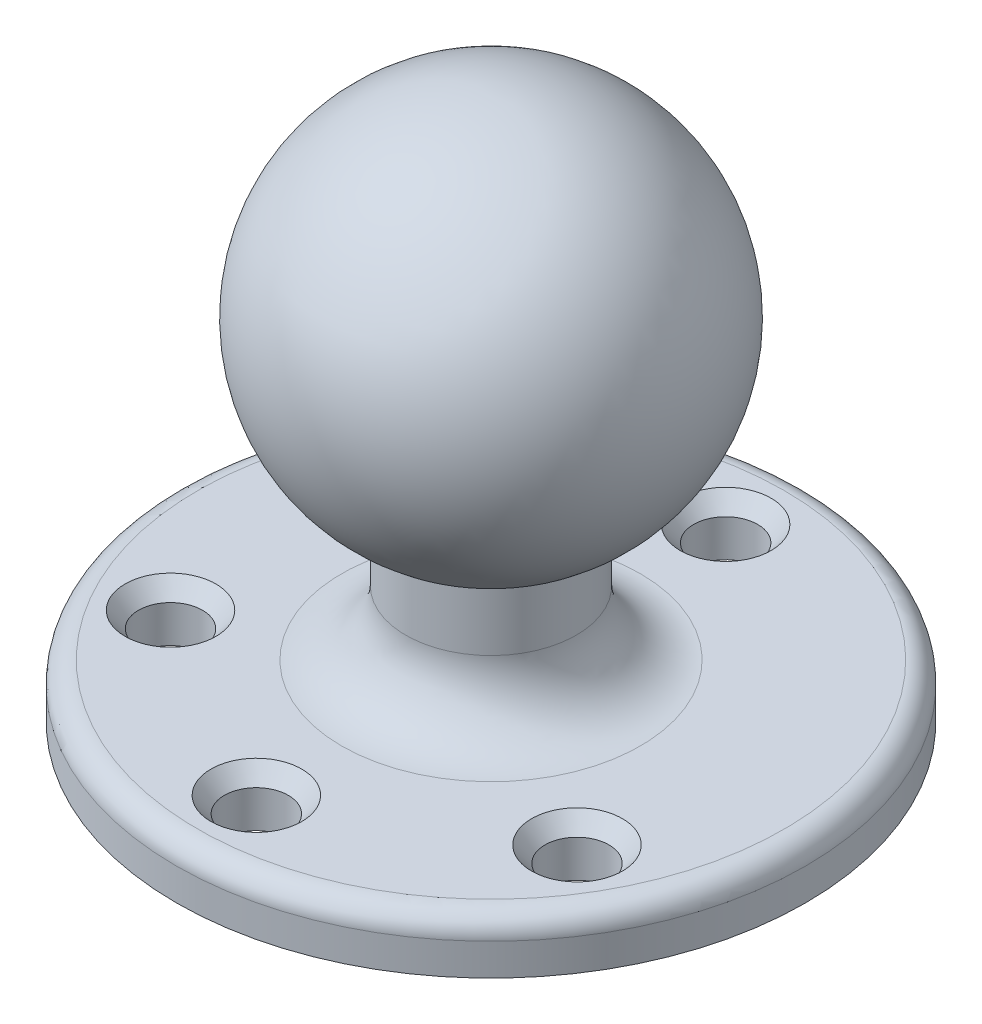
ISO-10303-21;
HEADER;
FILE_DESCRIPTION(('STEP AP214'),'2;1');
FILE_NAME('part.step','',(''),(''),'','','');
FILE_SCHEMA(('AUTOMOTIVE_DESIGN { 1 0 10303 214 1 1 1 1 }'));
ENDSEC;
DATA;
#1=APPLICATION_CONTEXT('core data for automotive mechanical design processes');
#2=APPLICATION_PROTOCOL_DEFINITION('international standard','automotive_design',2000,#1);
#3=PRODUCT_CONTEXT('',#1,'mechanical');
#4=PRODUCT('Part','Part','',(#3));
#5=PRODUCT_RELATED_PRODUCT_CATEGORY('part','',(#4));
#6=PRODUCT_DEFINITION_FORMATION('','',#4);
#7=PRODUCT_DEFINITION_CONTEXT('part definition',#1,'design');
#8=PRODUCT_DEFINITION('design','',#6,#7);
#9=PRODUCT_DEFINITION_SHAPE('','',#8);
#10=(LENGTH_UNIT() NAMED_UNIT(*) SI_UNIT(.MILLI.,.METRE.));
#11=(NAMED_UNIT(*) PLANE_ANGLE_UNIT() SI_UNIT($,.RADIAN.));
#12=(NAMED_UNIT(*) SI_UNIT($,.STERADIAN.) SOLID_ANGLE_UNIT());
#13=UNCERTAINTY_MEASURE_WITH_UNIT(LENGTH_MEASURE(1.E-05),#10,'distance_accuracy_value','');
#14=(GEOMETRIC_REPRESENTATION_CONTEXT(3) GLOBAL_UNCERTAINTY_ASSIGNED_CONTEXT((#13)) GLOBAL_UNIT_ASSIGNED_CONTEXT((#10,
#11,#12)) REPRESENTATION_CONTEXT('',''));
#15=CARTESIAN_POINT('',(0.,0.,0.));
#16=DIRECTION('',(0.,0.,1.));
#17=DIRECTION('',(1.,0.,0.));
#18=AXIS2_PLACEMENT_3D('',#15,#16,#17);
#19=CARTESIAN_POINT('',(0.,0.,0.));
#20=DIRECTION('',(0.,-1.,0.));
#21=DIRECTION('',(0.,0.,-1.));
#22=AXIS2_PLACEMENT_3D('',#19,#20,#21);
#23=PLANE('',#22);
#24=CARTESIAN_POINT('',(30.2514,0.,17.4498));
#25=DIRECTION('',(0.,-1.,0.));
#26=DIRECTION('',(0.,0.,-1.));
#27=AXIS2_PLACEMENT_3D('',#24,#25,#26);
#28=CIRCLE('',#27,4.7625);
#29=CARTESIAN_POINT('',(30.2514,0.,12.6873));
#30=VERTEX_POINT('',#29);
#31=EDGE_CURVE('E101',#30,#30,#28,.T.);
#32=ORIENTED_EDGE('',*,*,#31,.F.);
#33=EDGE_LOOP('',(#32));
#34=FACE_BOUND('',#33,.T.);
#35=CARTESIAN_POINT('',(0.,0.,-34.925));
#36=DIRECTION('',(0.,-1.,0.));
#37=DIRECTION('',(0.,0.,-1.));
#38=AXIS2_PLACEMENT_3D('',#35,#36,#37);
#39=CIRCLE('',#38,4.7625);
#40=CARTESIAN_POINT('',(0.,0.,-39.6875));
#41=VERTEX_POINT('',#40);
#42=EDGE_CURVE('E105',#41,#41,#39,.T.);
#43=ORIENTED_EDGE('',*,*,#42,.F.);
#44=EDGE_LOOP('',(#43));
#45=FACE_BOUND('',#44,.T.);
#46=CARTESIAN_POINT('',(0.,0.,34.925));
#47=DIRECTION('',(0.,-1.,0.));
#48=DIRECTION('',(0.,0.,-1.));
#49=AXIS2_PLACEMENT_3D('',#46,#47,#48);
#50=CIRCLE('',#49,4.7625);
#51=CARTESIAN_POINT('',(0.,0.,30.1625));
#52=VERTEX_POINT('',#51);
#53=EDGE_CURVE('E102',#52,#52,#50,.T.);
#54=ORIENTED_EDGE('',*,*,#53,.F.);
#55=EDGE_LOOP('',(#54));
#56=FACE_BOUND('',#55,.T.);
#57=CARTESIAN_POINT('',(-30.2514,0.,17.4498));
#58=DIRECTION('',(0.,-1.,0.));
#59=DIRECTION('',(0.,0.,-1.));
#60=AXIS2_PLACEMENT_3D('',#57,#58,#59);
#61=CIRCLE('',#60,4.7625);
#62=CARTESIAN_POINT('',(-30.2514,0.,12.6873));
#63=VERTEX_POINT('',#62);
#64=EDGE_CURVE('E98',#63,#63,#61,.T.);
#65=ORIENTED_EDGE('',*,*,#64,.F.);
#66=EDGE_LOOP('',(#65));
#67=FACE_BOUND('',#66,.T.);
#68=CARTESIAN_POINT('',(0.,0.,0.));
#69=DIRECTION('',(0.,-1.,0.));
#70=DIRECTION('',(0.,0.,-1.));
#71=AXIS2_PLACEMENT_3D('',#68,#69,#70);
#72=CIRCLE('',#71,46.8249);
#73=CARTESIAN_POINT('',(0.,0.,-46.8249));
#74=VERTEX_POINT('',#73);
#75=EDGE_CURVE('E80',#74,#74,#72,.T.);
#76=ORIENTED_EDGE('',*,*,#75,.T.);
#77=EDGE_LOOP('',(#76));
#78=FACE_BOUND('',#77,.T.);
#79=ADVANCED_FACE('F48',(#34,#45,#56,#67,#78),#23,.T.);
#80=CARTESIAN_POINT('',(0.,0.,0.));
#81=DIRECTION('',(0.,-1.,0.));
#82=DIRECTION('',(0.,0.,-1.));
#83=AXIS2_PLACEMENT_3D('',#80,#81,#82);
#84=CYLINDRICAL_SURFACE('',#83,46.8249);
#85=CARTESIAN_POINT('',(0.,4.7498,0.));
#86=DIRECTION('',(0.,-1.,0.));
#87=DIRECTION('',(0.,0.,-1.));
#88=AXIS2_PLACEMENT_3D('',#85,#86,#87);
#89=CIRCLE('',#88,46.8249);
#90=CARTESIAN_POINT('',(0.,4.7498,-46.8249));
#91=VERTEX_POINT('',#90);
#92=EDGE_CURVE('E83',#91,#91,#89,.T.);
#93=ORIENTED_EDGE('',*,*,#92,.T.);
#94=EDGE_LOOP('',(#93));
#95=FACE_BOUND('',#94,.T.);
#96=ORIENTED_EDGE('',*,*,#75,.F.);
#97=EDGE_LOOP('',(#96));
#98=FACE_BOUND('',#97,.T.);
#99=ADVANCED_FACE('F115',(#95,#98),#84,.T.);
#100=CARTESIAN_POINT('',(0.,4.7498,0.));
#101=DIRECTION('',(0.,-1.,0.));
#102=DIRECTION('',(0.,0.,-1.));
#103=AXIS2_PLACEMENT_3D('',#100,#101,#102);
#104=TOROIDAL_SURFACE('',#103,43.6499,3.175);
#105=CARTESIAN_POINT('',(0.,7.9248,0.));
#106=DIRECTION('',(0.,-1.,0.));
#107=DIRECTION('',(0.,0.,-1.));
#108=AXIS2_PLACEMENT_3D('',#105,#106,#107);
#109=CIRCLE('',#108,43.6499);
#110=CARTESIAN_POINT('',(0.,7.9248,-43.6499));
#111=VERTEX_POINT('',#110);
#112=EDGE_CURVE('E86',#111,#111,#109,.T.);
#113=ORIENTED_EDGE('',*,*,#112,.T.);
#114=EDGE_LOOP('',(#113));
#115=FACE_BOUND('',#114,.T.);
#116=ORIENTED_EDGE('',*,*,#92,.F.);
#117=EDGE_LOOP('',(#116));
#118=FACE_BOUND('',#117,.T.);
#119=ADVANCED_FACE('F126',(#115,#118),#104,.T.);
#120=CARTESIAN_POINT('',(0.,7.9248,-43.6499));
#121=DIRECTION('',(0.,1.,0.));
#122=DIRECTION('',(0.,0.,1.));
#123=AXIS2_PLACEMENT_3D('',#120,#121,#122);
#124=PLANE('',#123);
#125=CARTESIAN_POINT('',(-30.2514,7.9248,17.4498));
#126=DIRECTION('',(0.,1.,0.));
#127=DIRECTION('',(0.,0.,1.));
#128=AXIS2_PLACEMENT_3D('',#125,#126,#127);
#129=CIRCLE('',#128,6.7625);
#130=CARTESIAN_POINT('',(-30.2514,7.9248,24.2123));
#131=VERTEX_POINT('',#130);
#132=EDGE_CURVE('E63',#131,#131,#129,.F.);
#133=ORIENTED_EDGE('',*,*,#132,.T.);
#134=EDGE_LOOP('',(#133));
#135=FACE_BOUND('',#134,.T.);
#136=CARTESIAN_POINT('',(0.,7.9248,-34.925));
#137=DIRECTION('',(0.,1.,0.));
#138=DIRECTION('',(0.,0.,1.));
#139=AXIS2_PLACEMENT_3D('',#136,#137,#138);
#140=CIRCLE('',#139,6.7625);
#141=CARTESIAN_POINT('',(0.,7.9248,-28.1625));
#142=VERTEX_POINT('',#141);
#143=EDGE_CURVE('E68',#142,#142,#140,.F.);
#144=ORIENTED_EDGE('',*,*,#143,.T.);
#145=EDGE_LOOP('',(#144));
#146=FACE_BOUND('',#145,.T.);
#147=CARTESIAN_POINT('',(30.2514,7.9248,17.4498));
#148=DIRECTION('',(0.,1.,0.));
#149=DIRECTION('',(0.,0.,1.));
#150=AXIS2_PLACEMENT_3D('',#147,#148,#149);
#151=CIRCLE('',#150,6.7625);
#152=CARTESIAN_POINT('',(30.2514,7.9248,24.2123));
#153=VERTEX_POINT('',#152);
#154=EDGE_CURVE('E71',#153,#153,#151,.F.);
#155=ORIENTED_EDGE('',*,*,#154,.T.);
#156=EDGE_LOOP('',(#155));
#157=FACE_BOUND('',#156,.T.);
#158=CARTESIAN_POINT('',(0.,7.9248,34.925));
#159=DIRECTION('',(0.,1.,0.));
#160=DIRECTION('',(0.,0.,1.));
#161=AXIS2_PLACEMENT_3D('',#158,#159,#160);
#162=CIRCLE('',#161,6.7625);
#163=CARTESIAN_POINT('',(0.,7.9248,41.6875));
#164=VERTEX_POINT('',#163);
#165=EDGE_CURVE('E74',#164,#164,#162,.F.);
#166=ORIENTED_EDGE('',*,*,#165,.T.);
#167=EDGE_LOOP('',(#166));
#168=FACE_BOUND('',#167,.T.);
#169=CARTESIAN_POINT('',(0.,7.9248,0.));
#170=DIRECTION('',(0.,-1.,0.));
#171=DIRECTION('',(0.,0.,-1.));
#172=AXIS2_PLACEMENT_3D('',#169,#170,#171);
#173=CIRCLE('',#172,22.2250000000001);
#174=CARTESIAN_POINT('',(0.,7.9248,-22.2250000000001));
#175=VERTEX_POINT('',#174);
#176=EDGE_CURVE('E89',#175,#175,#173,.T.);
#177=ORIENTED_EDGE('',*,*,#176,.T.);
#178=EDGE_LOOP('',(#177));
#179=FACE_BOUND('',#178,.T.);
#180=ORIENTED_EDGE('',*,*,#112,.F.);
#181=EDGE_LOOP('',(#180));
#182=FACE_BOUND('',#181,.T.);
#183=ADVANCED_FACE('F132',(#135,#146,#157,#168,#179,#182),#124,.T.);
#184=CARTESIAN_POINT('',(0.,17.4498,0.));
#185=DIRECTION('',(0.,-1.,0.));
#186=DIRECTION('',(0.,0.,-1.));
#187=AXIS2_PLACEMENT_3D('',#184,#185,#186);
#188=TOROIDAL_SURFACE('',#187,22.225,9.525);
#189=CARTESIAN_POINT('',(0.,17.4498,0.));
#190=DIRECTION('',(0.,-1.,0.));
#191=DIRECTION('',(0.,0.,-1.));
#192=AXIS2_PLACEMENT_3D('',#189,#190,#191);
#193=CIRCLE('',#192,12.7);
#194=CARTESIAN_POINT('',(0.,17.4498,-12.7));
#195=VERTEX_POINT('',#194);
#196=EDGE_CURVE('E92',#195,#195,#193,.T.);
#197=ORIENTED_EDGE('',*,*,#196,.T.);
#198=EDGE_LOOP('',(#197));
#199=FACE_BOUND('',#198,.T.);
#200=ORIENTED_EDGE('',*,*,#176,.F.);
#201=EDGE_LOOP('',(#200));
#202=FACE_BOUND('',#201,.T.);
#203=ADVANCED_FACE('F156',(#199,#202),#188,.F.);
#204=CARTESIAN_POINT('',(0.,0.,0.));
#205=DIRECTION('',(0.,-1.,0.));
#206=DIRECTION('',(0.,0.,-1.));
#207=AXIS2_PLACEMENT_3D('',#204,#205,#206);
#208=CYLINDRICAL_SURFACE('',#207,12.7);
#209=CARTESIAN_POINT('',(0.,26.4723316491521,0.));
#210=DIRECTION('',(0.,-1.,0.));
#211=DIRECTION('',(0.,0.,-1.));
#212=AXIS2_PLACEMENT_3D('',#209,#210,#211);
#213=CIRCLE('',#212,12.7);
#214=CARTESIAN_POINT('',(0.,26.4723316491521,-12.7));
#215=VERTEX_POINT('',#214);
#216=EDGE_CURVE('E95',#215,#215,#213,.T.);
#217=ORIENTED_EDGE('',*,*,#216,.T.);
#218=EDGE_LOOP('',(#217));
#219=FACE_BOUND('',#218,.T.);
#220=ORIENTED_EDGE('',*,*,#196,.F.);
#221=EDGE_LOOP('',(#220));
#222=FACE_BOUND('',#221,.T.);
#223=ADVANCED_FACE('F167',(#219,#222),#208,.T.);
#224=CARTESIAN_POINT('',(0.,52.07,0.));
#225=DIRECTION('',(0.,-1.,0.));
#226=DIRECTION('',(0.,0.,-1.));
#227=AXIS2_PLACEMENT_3D('',#224,#225,#226);
#228=SPHERICAL_SURFACE('',#227,28.575);
#229=ORIENTED_EDGE('',*,*,#216,.F.);
#230=EDGE_LOOP('',(#229));
#231=FACE_BOUND('',#230,.T.);
#232=ADVANCED_FACE('F173',(#231),#228,.T.);
#233=CARTESIAN_POINT('',(-30.2514,10.,17.4498));
#234=DIRECTION('',(0.,-1.,0.));
#235=DIRECTION('',(0.,0.,-1.));
#236=AXIS2_PLACEMENT_3D('',#233,#234,#235);
#237=CYLINDRICAL_SURFACE('',#236,4.7625);
#238=CARTESIAN_POINT('',(-30.2514,5.54129281481157,17.4498));
#239=DIRECTION('',(0.,1.,0.));
#240=DIRECTION('',(0.,0.,1.));
#241=AXIS2_PLACEMENT_3D('',#238,#239,#240);
#242=CIRCLE('',#241,4.7625);
#243=CARTESIAN_POINT('',(-30.2514,5.54129281481157,22.2123));
#244=VERTEX_POINT('',#243);
#245=EDGE_CURVE('E77',#244,#244,#242,.T.);
#246=ORIENTED_EDGE('',*,*,#245,.T.);
#247=EDGE_LOOP('',(#246));
#248=FACE_BOUND('',#247,.T.);
#249=ORIENTED_EDGE('',*,*,#64,.T.);
#250=EDGE_LOOP('',(#249));
#251=FACE_BOUND('',#250,.T.);
#252=ADVANCED_FACE('F179',(#248,#251),#237,.F.);
#253=CARTESIAN_POINT('',(0.,10.,34.925));
#254=DIRECTION('',(0.,-1.,0.));
#255=DIRECTION('',(0.,0.,-1.));
#256=AXIS2_PLACEMENT_3D('',#253,#254,#255);
#257=CYLINDRICAL_SURFACE('',#256,4.7625);
#258=CARTESIAN_POINT('',(0.,5.54129281481158,34.925));
#259=DIRECTION('',(0.,1.,0.));
#260=DIRECTION('',(0.,0.,1.));
#261=AXIS2_PLACEMENT_3D('',#258,#259,#260);
#262=CIRCLE('',#261,4.7625);
#263=CARTESIAN_POINT('',(0.,5.54129281481158,39.6875));
#264=VERTEX_POINT('',#263);
#265=EDGE_CURVE('E12',#264,#264,#262,.T.);
#266=ORIENTED_EDGE('',*,*,#265,.T.);
#267=EDGE_LOOP('',(#266));
#268=FACE_BOUND('',#267,.T.);
#269=ORIENTED_EDGE('',*,*,#53,.T.);
#270=EDGE_LOOP('',(#269));
#271=FACE_BOUND('',#270,.T.);
#272=ADVANCED_FACE('F183',(#268,#271),#257,.F.);
#273=CARTESIAN_POINT('',(0.,10.,-34.925));
#274=DIRECTION('',(0.,-1.,0.));
#275=DIRECTION('',(0.,0.,-1.));
#276=AXIS2_PLACEMENT_3D('',#273,#274,#275);
#277=CYLINDRICAL_SURFACE('',#276,4.7625);
#278=CARTESIAN_POINT('',(0.,5.54129281481158,-34.925));
#279=DIRECTION('',(0.,1.,0.));
#280=DIRECTION('',(0.,0.,1.));
#281=AXIS2_PLACEMENT_3D('',#278,#279,#280);
#282=CIRCLE('',#281,4.7625);
#283=CARTESIAN_POINT('',(0.,5.54129281481158,-30.1625));
#284=VERTEX_POINT('',#283);
#285=EDGE_CURVE('E59',#284,#284,#282,.T.);
#286=ORIENTED_EDGE('',*,*,#285,.T.);
#287=EDGE_LOOP('',(#286));
#288=FACE_BOUND('',#287,.T.);
#289=ORIENTED_EDGE('',*,*,#42,.T.);
#290=EDGE_LOOP('',(#289));
#291=FACE_BOUND('',#290,.T.);
#292=ADVANCED_FACE('F187',(#288,#291),#277,.F.);
#293=CARTESIAN_POINT('',(30.2514,10.,17.4498));
#294=DIRECTION('',(0.,-1.,0.));
#295=DIRECTION('',(0.,0.,-1.));
#296=AXIS2_PLACEMENT_3D('',#293,#294,#295);
#297=CYLINDRICAL_SURFACE('',#296,4.7625);
#298=CARTESIAN_POINT('',(30.2514,5.54129281481157,17.4498));
#299=DIRECTION('',(0.,1.,0.));
#300=DIRECTION('',(0.,0.,1.));
#301=AXIS2_PLACEMENT_3D('',#298,#299,#300);
#302=CIRCLE('',#301,4.7625);
#303=CARTESIAN_POINT('',(30.2514,5.54129281481157,22.2123));
#304=VERTEX_POINT('',#303);
#305=EDGE_CURVE('E55',#304,#304,#302,.T.);
#306=ORIENTED_EDGE('',*,*,#305,.T.);
#307=EDGE_LOOP('',(#306));
#308=FACE_BOUND('',#307,.T.);
#309=ORIENTED_EDGE('',*,*,#31,.T.);
#310=EDGE_LOOP('',(#309));
#311=FACE_BOUND('',#310,.T.);
#312=ADVANCED_FACE('F111',(#308,#311),#297,.F.);
#313=CARTESIAN_POINT('',(-30.2514,5.54129281481157,17.4498));
#314=DIRECTION('',(0.,1.,0.));
#315=DIRECTION('',(0.,0.,1.));
#316=AXIS2_PLACEMENT_3D('',#313,#314,#315);
#317=CONICAL_SURFACE('',#316,4.7625,0.698131700797732);
#318=ORIENTED_EDGE('',*,*,#132,.F.);
#319=EDGE_LOOP('',(#318));
#320=FACE_BOUND('',#319,.T.);
#321=ORIENTED_EDGE('',*,*,#245,.F.);
#322=EDGE_LOOP('',(#321));
#323=FACE_BOUND('',#322,.T.);
#324=ADVANCED_FACE('F137',(#320,#323),#317,.F.);
#325=CARTESIAN_POINT('',(0.,5.54129281481158,-34.925));
#326=DIRECTION('',(0.,1.,0.));
#327=DIRECTION('',(0.,0.,1.));
#328=AXIS2_PLACEMENT_3D('',#325,#326,#327);
#329=CONICAL_SURFACE('',#328,4.7625,0.698131700797732);
#330=ORIENTED_EDGE('',*,*,#143,.F.);
#331=EDGE_LOOP('',(#330));
#332=FACE_BOUND('',#331,.T.);
#333=ORIENTED_EDGE('',*,*,#285,.F.);
#334=EDGE_LOOP('',(#333));
#335=FACE_BOUND('',#334,.T.);
#336=ADVANCED_FACE('F140',(#332,#335),#329,.F.);
#337=CARTESIAN_POINT('',(30.2514,5.54129281481157,17.4498));
#338=DIRECTION('',(0.,1.,0.));
#339=DIRECTION('',(0.,0.,1.));
#340=AXIS2_PLACEMENT_3D('',#337,#338,#339);
#341=CONICAL_SURFACE('',#340,4.7625,0.698131700797732);
#342=ORIENTED_EDGE('',*,*,#154,.F.);
#343=EDGE_LOOP('',(#342));
#344=FACE_BOUND('',#343,.T.);
#345=ORIENTED_EDGE('',*,*,#305,.F.);
#346=EDGE_LOOP('',(#345));
#347=FACE_BOUND('',#346,.T.);
#348=ADVANCED_FACE('F143',(#344,#347),#341,.F.);
#349=CARTESIAN_POINT('',(0.,5.54129281481158,34.925));
#350=DIRECTION('',(0.,1.,0.));
#351=DIRECTION('',(0.,0.,1.));
#352=AXIS2_PLACEMENT_3D('',#349,#350,#351);
#353=CONICAL_SURFACE('',#352,4.7625,0.698131700797732);
#354=ORIENTED_EDGE('',*,*,#165,.F.);
#355=EDGE_LOOP('',(#354));
#356=FACE_BOUND('',#355,.T.);
#357=ORIENTED_EDGE('',*,*,#265,.F.);
#358=EDGE_LOOP('',(#357));
#359=FACE_BOUND('',#358,.T.);
#360=ADVANCED_FACE('F50',(#356,#359),#353,.F.);
#361=CLOSED_SHELL('',(#79,#99,#119,#183,#203,#223,#232,#252,#272,#292,#312,#324,#336,#348,#360));
#362=MANIFOLD_SOLID_BREP('B2',#361);
#363=ADVANCED_BREP_SHAPE_REPRESENTATION('',(#18,#362),#14);
#364=SHAPE_DEFINITION_REPRESENTATION(#9,#363);
ENDSEC;
END-ISO-10303-21;
